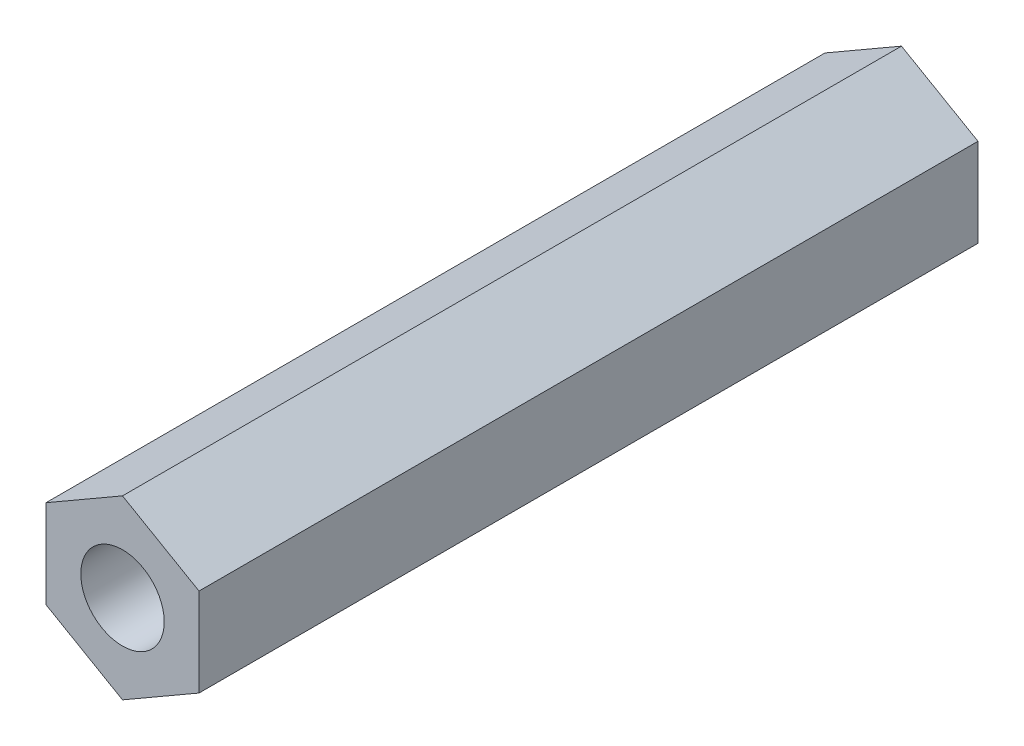
ISO-10303-21;
HEADER;
FILE_DESCRIPTION(('STEP AP214'),'2;1');
FILE_NAME('part.step','',(''),(''),'','','');
FILE_SCHEMA(('AUTOMOTIVE_DESIGN { 1 0 10303 214 1 1 1 1 }'));
ENDSEC;
DATA;
#1=APPLICATION_CONTEXT('core data for automotive mechanical design processes');
#2=APPLICATION_PROTOCOL_DEFINITION('international standard','automotive_design',2000,#1);
#3=PRODUCT_CONTEXT('',#1,'mechanical');
#4=PRODUCT('Part','Part','',(#3));
#5=PRODUCT_RELATED_PRODUCT_CATEGORY('part','',(#4));
#6=PRODUCT_DEFINITION_FORMATION('','',#4);
#7=PRODUCT_DEFINITION_CONTEXT('part definition',#1,'design');
#8=PRODUCT_DEFINITION('design','',#6,#7);
#9=PRODUCT_DEFINITION_SHAPE('','',#8);
#10=(LENGTH_UNIT() NAMED_UNIT(*) SI_UNIT(.MILLI.,.METRE.));
#11=(NAMED_UNIT(*) PLANE_ANGLE_UNIT() SI_UNIT($,.RADIAN.));
#12=(NAMED_UNIT(*) SI_UNIT($,.STERADIAN.) SOLID_ANGLE_UNIT());
#13=UNCERTAINTY_MEASURE_WITH_UNIT(LENGTH_MEASURE(1.E-05),#10,'distance_accuracy_value','');
#14=(GEOMETRIC_REPRESENTATION_CONTEXT(3) GLOBAL_UNCERTAINTY_ASSIGNED_CONTEXT((#13)) GLOBAL_UNIT_ASSIGNED_CONTEXT((#10,
#11,#12)) REPRESENTATION_CONTEXT('',''));
#15=CARTESIAN_POINT('',(0.,0.,0.));
#16=DIRECTION('',(0.,0.,1.));
#17=DIRECTION('',(1.,0.,0.));
#18=AXIS2_PLACEMENT_3D('',#15,#16,#17);
#19=CARTESIAN_POINT('',(0.,0.,28.));
#20=DIRECTION('',(0.,0.,1.));
#21=DIRECTION('',(1.,0.,0.));
#22=AXIS2_PLACEMENT_3D('',#19,#20,#21);
#23=PLANE('',#22);
#24=DIRECTION('',(0.866025403784439,-0.5,0.));
#25=VECTOR('',#24,1.);
#26=CARTESIAN_POINT('',(-2.75,-1.58771324027147,28.));
#27=LINE('',#26,#25);
#28=CARTESIAN_POINT('',(-2.75,-1.58771324027147,28.));
#29=VERTEX_POINT('',#28);
#30=CARTESIAN_POINT('',(0.,-3.17542648054294,28.));
#31=VERTEX_POINT('',#30);
#32=EDGE_CURVE('E148',#29,#31,#27,.T.);
#33=ORIENTED_EDGE('',*,*,#32,.T.);
#34=DIRECTION('',(0.866025403784438,0.5,0.));
#35=VECTOR('',#34,1.);
#36=CARTESIAN_POINT('',(0.,-3.17542648054294,28.));
#37=LINE('',#36,#35);
#38=CARTESIAN_POINT('',(2.75,-1.58771324027147,28.));
#39=VERTEX_POINT('',#38);
#40=EDGE_CURVE('E96',#31,#39,#37,.T.);
#41=ORIENTED_EDGE('',*,*,#40,.T.);
#42=DIRECTION('',(0.,1.,0.));
#43=VECTOR('',#42,1.);
#44=CARTESIAN_POINT('',(2.75,-1.58771324027147,28.));
#45=LINE('',#44,#43);
#46=CARTESIAN_POINT('',(2.75,1.58771324027147,28.));
#47=VERTEX_POINT('',#46);
#48=EDGE_CURVE('E109',#39,#47,#45,.T.);
#49=ORIENTED_EDGE('',*,*,#48,.T.);
#50=DIRECTION('',(-0.866025403784438,0.5,0.));
#51=VECTOR('',#50,1.);
#52=CARTESIAN_POINT('',(2.75,1.58771324027147,28.));
#53=LINE('',#52,#51);
#54=CARTESIAN_POINT('',(0.,3.17542648054294,28.));
#55=VERTEX_POINT('',#54);
#56=EDGE_CURVE('E103',#47,#55,#53,.T.);
#57=ORIENTED_EDGE('',*,*,#56,.T.);
#58=DIRECTION('',(-0.866025403784438,-0.5,0.));
#59=VECTOR('',#58,1.);
#60=CARTESIAN_POINT('',(0.,3.17542648054294,28.));
#61=LINE('',#60,#59);
#62=CARTESIAN_POINT('',(-2.75,1.58771324027147,28.));
#63=VERTEX_POINT('',#62);
#64=EDGE_CURVE('E107',#55,#63,#61,.T.);
#65=ORIENTED_EDGE('',*,*,#64,.T.);
#66=DIRECTION('',(0.,-1.,0.));
#67=VECTOR('',#66,1.);
#68=CARTESIAN_POINT('',(-2.75,1.58771324027147,28.));
#69=LINE('',#68,#67);
#70=EDGE_CURVE('E59',#63,#29,#69,.T.);
#71=ORIENTED_EDGE('',*,*,#70,.T.);
#72=EDGE_LOOP('',(#33,#41,#49,#57,#65,#71));
#73=FACE_BOUND('',#72,.T.);
#74=CARTESIAN_POINT('',(0.,0.,28.));
#75=DIRECTION('',(0.,0.,1.));
#76=DIRECTION('',(1.,0.,0.));
#77=AXIS2_PLACEMENT_3D('',#74,#75,#76);
#78=CIRCLE('',#77,1.5);
#79=CARTESIAN_POINT('',(1.5,0.,28.));
#80=VERTEX_POINT('',#79);
#81=EDGE_CURVE('E136',#80,#80,#78,.T.);
#82=ORIENTED_EDGE('',*,*,#81,.F.);
#83=EDGE_LOOP('',(#82));
#84=FACE_BOUND('',#83,.T.);
#85=ADVANCED_FACE('F41',(#73,#84),#23,.T.);
#86=CARTESIAN_POINT('',(0.,0.,0.));
#87=DIRECTION('',(0.,0.,1.));
#88=DIRECTION('',(1.,0.,0.));
#89=AXIS2_PLACEMENT_3D('',#86,#87,#88);
#90=PLANE('',#89);
#91=DIRECTION('',(0.866025403784439,-0.5,0.));
#92=VECTOR('',#91,1.);
#93=CARTESIAN_POINT('',(-2.75,-1.58771324027147,0.));
#94=LINE('',#93,#92);
#95=CARTESIAN_POINT('',(-2.75,-1.58771324027147,0.));
#96=VERTEX_POINT('',#95);
#97=CARTESIAN_POINT('',(0.,-3.17542648054294,0.));
#98=VERTEX_POINT('',#97);
#99=EDGE_CURVE('E131',#96,#98,#94,.T.);
#100=ORIENTED_EDGE('',*,*,#99,.F.);
#101=DIRECTION('',(0.,-1.,0.));
#102=VECTOR('',#101,1.);
#103=CARTESIAN_POINT('',(-2.75,1.58771324027147,0.));
#104=LINE('',#103,#102);
#105=CARTESIAN_POINT('',(-2.75,1.58771324027147,0.));
#106=VERTEX_POINT('',#105);
#107=EDGE_CURVE('E88',#106,#96,#104,.T.);
#108=ORIENTED_EDGE('',*,*,#107,.F.);
#109=DIRECTION('',(-0.866025403784438,-0.5,0.));
#110=VECTOR('',#109,1.);
#111=CARTESIAN_POINT('',(0.,3.17542648054294,0.));
#112=LINE('',#111,#110);
#113=CARTESIAN_POINT('',(0.,3.17542648054294,0.));
#114=VERTEX_POINT('',#113);
#115=EDGE_CURVE('E82',#114,#106,#112,.T.);
#116=ORIENTED_EDGE('',*,*,#115,.F.);
#117=DIRECTION('',(-0.866025403784438,0.5,0.));
#118=VECTOR('',#117,1.);
#119=CARTESIAN_POINT('',(2.75,1.58771324027147,0.));
#120=LINE('',#119,#118);
#121=CARTESIAN_POINT('',(2.75,1.58771324027147,0.));
#122=VERTEX_POINT('',#121);
#123=EDGE_CURVE('E118',#122,#114,#120,.T.);
#124=ORIENTED_EDGE('',*,*,#123,.F.);
#125=DIRECTION('',(0.,1.,0.));
#126=VECTOR('',#125,1.);
#127=CARTESIAN_POINT('',(2.75,-1.58771324027147,0.));
#128=LINE('',#127,#126);
#129=CARTESIAN_POINT('',(2.75,-1.58771324027147,0.));
#130=VERTEX_POINT('',#129);
#131=EDGE_CURVE('E139',#130,#122,#128,.T.);
#132=ORIENTED_EDGE('',*,*,#131,.F.);
#133=DIRECTION('',(0.866025403784438,0.5,0.));
#134=VECTOR('',#133,1.);
#135=CARTESIAN_POINT('',(0.,-3.17542648054294,0.));
#136=LINE('',#135,#134);
#137=EDGE_CURVE('E135',#98,#130,#136,.T.);
#138=ORIENTED_EDGE('',*,*,#137,.F.);
#139=EDGE_LOOP('',(#100,#108,#116,#124,#132,#138));
#140=FACE_BOUND('',#139,.T.);
#141=CARTESIAN_POINT('',(0.,0.,0.));
#142=DIRECTION('',(0.,0.,1.));
#143=DIRECTION('',(1.,0.,0.));
#144=AXIS2_PLACEMENT_3D('',#141,#142,#143);
#145=CIRCLE('',#144,1.5);
#146=CARTESIAN_POINT('',(1.5,0.,0.));
#147=VERTEX_POINT('',#146);
#148=EDGE_CURVE('E245',#147,#147,#145,.T.);
#149=ORIENTED_EDGE('',*,*,#148,.T.);
#150=EDGE_LOOP('',(#149));
#151=FACE_BOUND('',#150,.T.);
#152=ADVANCED_FACE('F161',(#140,#151),#90,.F.);
#153=CARTESIAN_POINT('',(-2.75,-1.58771324027147,28.));
#154=DIRECTION('',(0.5,0.866025403784439,0.));
#155=DIRECTION('',(-0.866025403784439,0.5,0.));
#156=AXIS2_PLACEMENT_3D('',#153,#154,#155);
#157=PLANE('',#156);
#158=ORIENTED_EDGE('',*,*,#99,.T.);
#159=DIRECTION('',(0.,0.,-1.));
#160=VECTOR('',#159,1.);
#161=CARTESIAN_POINT('',(0.,-3.17542648054294,28.));
#162=LINE('',#161,#160);
#163=EDGE_CURVE('E11',#31,#98,#162,.T.);
#164=ORIENTED_EDGE('',*,*,#163,.F.);
#165=ORIENTED_EDGE('',*,*,#32,.F.);
#166=DIRECTION('',(0.,0.,-1.));
#167=VECTOR('',#166,1.);
#168=CARTESIAN_POINT('',(-2.75,-1.58771324027147,28.));
#169=LINE('',#168,#167);
#170=EDGE_CURVE('E127',#29,#96,#169,.T.);
#171=ORIENTED_EDGE('',*,*,#170,.T.);
#172=EDGE_LOOP('',(#158,#164,#165,#171));
#173=FACE_BOUND('',#172,.T.);
#174=ADVANCED_FACE('F43',(#173),#157,.F.);
#175=CARTESIAN_POINT('',(0.,-3.17542648054294,28.));
#176=DIRECTION('',(-0.5,0.866025403784438,0.));
#177=DIRECTION('',(-0.866025403784439,-0.5,0.));
#178=AXIS2_PLACEMENT_3D('',#175,#176,#177);
#179=PLANE('',#178);
#180=ORIENTED_EDGE('',*,*,#137,.T.);
#181=DIRECTION('',(0.,0.,-1.));
#182=VECTOR('',#181,1.);
#183=CARTESIAN_POINT('',(2.75,-1.58771324027147,28.));
#184=LINE('',#183,#182);
#185=EDGE_CURVE('E51',#39,#130,#184,.T.);
#186=ORIENTED_EDGE('',*,*,#185,.F.);
#187=ORIENTED_EDGE('',*,*,#40,.F.);
#188=ORIENTED_EDGE('',*,*,#163,.T.);
#189=EDGE_LOOP('',(#180,#186,#187,#188));
#190=FACE_BOUND('',#189,.T.);
#191=ADVANCED_FACE('F186',(#190),#179,.F.);
#192=CARTESIAN_POINT('',(2.75,-1.58771324027147,28.));
#193=DIRECTION('',(-1.,0.,0.));
#194=DIRECTION('',(0.,0.,1.));
#195=AXIS2_PLACEMENT_3D('',#192,#193,#194);
#196=PLANE('',#195);
#197=ORIENTED_EDGE('',*,*,#131,.T.);
#198=DIRECTION('',(0.,0.,-1.));
#199=VECTOR('',#198,1.);
#200=CARTESIAN_POINT('',(2.75,1.58771324027147,28.));
#201=LINE('',#200,#199);
#202=EDGE_CURVE('E120',#47,#122,#201,.T.);
#203=ORIENTED_EDGE('',*,*,#202,.F.);
#204=ORIENTED_EDGE('',*,*,#48,.F.);
#205=ORIENTED_EDGE('',*,*,#185,.T.);
#206=EDGE_LOOP('',(#197,#203,#204,#205));
#207=FACE_BOUND('',#206,.T.);
#208=ADVANCED_FACE('F158',(#207),#196,.F.);
#209=CARTESIAN_POINT('',(2.75,1.58771324027147,28.));
#210=DIRECTION('',(-0.5,-0.866025403784439,0.));
#211=DIRECTION('',(0.866025403784439,-0.5,0.));
#212=AXIS2_PLACEMENT_3D('',#209,#210,#211);
#213=PLANE('',#212);
#214=ORIENTED_EDGE('',*,*,#123,.T.);
#215=DIRECTION('',(0.,0.,-1.));
#216=VECTOR('',#215,1.);
#217=CARTESIAN_POINT('',(0.,3.17542648054294,28.));
#218=LINE('',#217,#216);
#219=EDGE_CURVE('E115',#55,#114,#218,.T.);
#220=ORIENTED_EDGE('',*,*,#219,.F.);
#221=ORIENTED_EDGE('',*,*,#56,.F.);
#222=ORIENTED_EDGE('',*,*,#202,.T.);
#223=EDGE_LOOP('',(#214,#220,#221,#222));
#224=FACE_BOUND('',#223,.T.);
#225=ADVANCED_FACE('F116',(#224),#213,.F.);
#226=CARTESIAN_POINT('',(0.,3.17542648054294,28.));
#227=DIRECTION('',(0.5,-0.866025403784438,0.));
#228=DIRECTION('',(0.866025403784439,0.5,0.));
#229=AXIS2_PLACEMENT_3D('',#226,#227,#228);
#230=PLANE('',#229);
#231=ORIENTED_EDGE('',*,*,#115,.T.);
#232=DIRECTION('',(0.,0.,-1.));
#233=VECTOR('',#232,1.);
#234=CARTESIAN_POINT('',(-2.75,1.58771324027147,28.));
#235=LINE('',#234,#233);
#236=EDGE_CURVE('E121',#63,#106,#235,.T.);
#237=ORIENTED_EDGE('',*,*,#236,.F.);
#238=ORIENTED_EDGE('',*,*,#64,.F.);
#239=ORIENTED_EDGE('',*,*,#219,.T.);
#240=EDGE_LOOP('',(#231,#237,#238,#239));
#241=FACE_BOUND('',#240,.T.);
#242=ADVANCED_FACE('F123',(#241),#230,.F.);
#243=CARTESIAN_POINT('',(-2.75,1.58771324027147,28.));
#244=DIRECTION('',(1.,0.,0.));
#245=DIRECTION('',(0.,0.,-1.));
#246=AXIS2_PLACEMENT_3D('',#243,#244,#245);
#247=PLANE('',#246);
#248=ORIENTED_EDGE('',*,*,#107,.T.);
#249=ORIENTED_EDGE('',*,*,#170,.F.);
#250=ORIENTED_EDGE('',*,*,#70,.F.);
#251=ORIENTED_EDGE('',*,*,#236,.T.);
#252=EDGE_LOOP('',(#248,#249,#250,#251));
#253=FACE_BOUND('',#252,.T.);
#254=ADVANCED_FACE('F166',(#253),#247,.F.);
#255=CARTESIAN_POINT('',(0.,0.,28.));
#256=DIRECTION('',(0.,0.,-1.));
#257=DIRECTION('',(-1.,0.,0.));
#258=AXIS2_PLACEMENT_3D('',#255,#256,#257);
#259=CYLINDRICAL_SURFACE('',#258,1.5);
#260=ORIENTED_EDGE('',*,*,#81,.T.);
#261=EDGE_LOOP('',(#260));
#262=FACE_BOUND('',#261,.T.);
#263=ORIENTED_EDGE('',*,*,#148,.F.);
#264=EDGE_LOOP('',(#263));
#265=FACE_BOUND('',#264,.T.);
#266=ADVANCED_FACE('F168',(#262,#265),#259,.F.);
#267=CLOSED_SHELL('',(#85,#152,#174,#191,#208,#225,#242,#254,#266));
#268=MANIFOLD_SOLID_BREP('B2',#267);
#269=ADVANCED_BREP_SHAPE_REPRESENTATION('',(#18,#268),#14);
#270=SHAPE_DEFINITION_REPRESENTATION(#9,#269);
ENDSEC;
END-ISO-10303-21;
